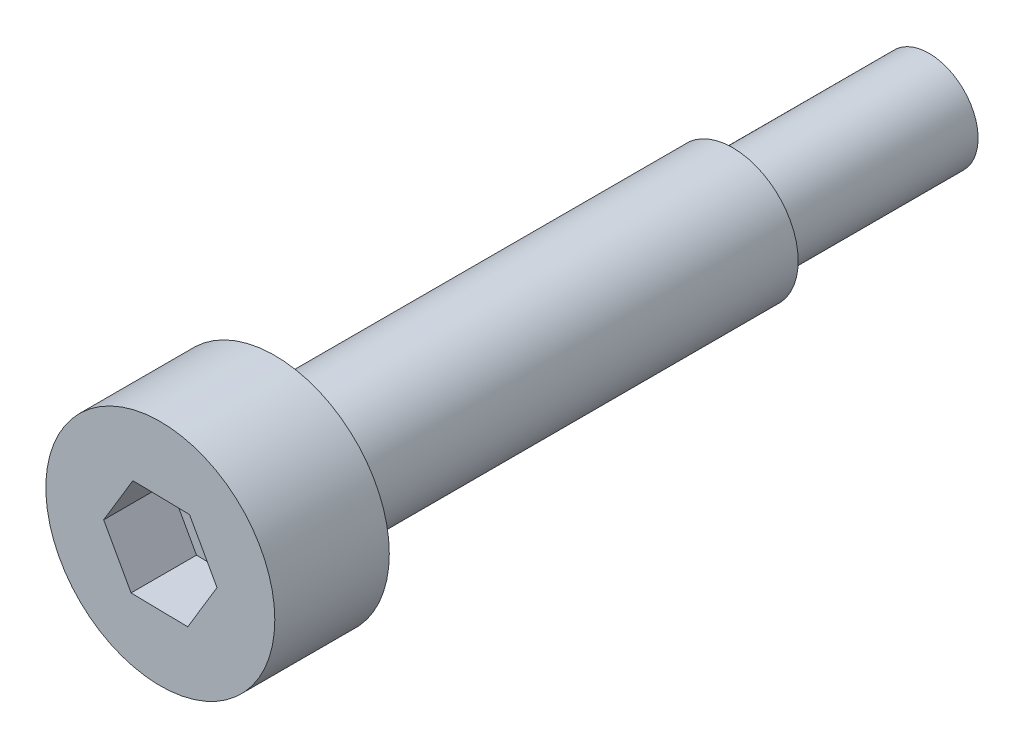
ISO-10303-21;
HEADER;
FILE_DESCRIPTION(('STEP AP214'),'2;1');
FILE_NAME('part.step','',(''),(''),'','','');
FILE_SCHEMA(('AUTOMOTIVE_DESIGN { 1 0 10303 214 1 1 1 1 }'));
ENDSEC;
DATA;
#1=APPLICATION_CONTEXT('core data for automotive mechanical design processes');
#2=APPLICATION_PROTOCOL_DEFINITION('international standard','automotive_design',2000,#1);
#3=PRODUCT_CONTEXT('',#1,'mechanical');
#4=PRODUCT('Part','Part','',(#3));
#5=PRODUCT_RELATED_PRODUCT_CATEGORY('part','',(#4));
#6=PRODUCT_DEFINITION_FORMATION('','',#4);
#7=PRODUCT_DEFINITION_CONTEXT('part definition',#1,'design');
#8=PRODUCT_DEFINITION('design','',#6,#7);
#9=PRODUCT_DEFINITION_SHAPE('','',#8);
#10=(LENGTH_UNIT() NAMED_UNIT(*) SI_UNIT(.MILLI.,.METRE.));
#11=(NAMED_UNIT(*) PLANE_ANGLE_UNIT() SI_UNIT($,.RADIAN.));
#12=(NAMED_UNIT(*) SI_UNIT($,.STERADIAN.) SOLID_ANGLE_UNIT());
#13=UNCERTAINTY_MEASURE_WITH_UNIT(LENGTH_MEASURE(1.E-05),#10,'distance_accuracy_value','');
#14=(GEOMETRIC_REPRESENTATION_CONTEXT(3) GLOBAL_UNCERTAINTY_ASSIGNED_CONTEXT((#13)) GLOBAL_UNIT_ASSIGNED_CONTEXT((#10,
#11,#12)) REPRESENTATION_CONTEXT('',''));
#15=CARTESIAN_POINT('',(0.,0.,0.));
#16=DIRECTION('',(0.,0.,1.));
#17=DIRECTION('',(1.,0.,0.));
#18=AXIS2_PLACEMENT_3D('',#15,#16,#17);
#19=CARTESIAN_POINT('',(0.,0.,3.5));
#20=DIRECTION('',(0.,0.,-1.));
#21=DIRECTION('',(-1.,0.,0.));
#22=AXIS2_PLACEMENT_3D('',#19,#20,#21);
#23=CYLINDRICAL_SURFACE('',#22,3.5);
#24=CARTESIAN_POINT('',(0.,0.,3.5));
#25=DIRECTION('',(0.,0.,1.));
#26=DIRECTION('',(1.,0.,0.));
#27=AXIS2_PLACEMENT_3D('',#24,#25,#26);
#28=CIRCLE('',#27,3.5);
#29=CARTESIAN_POINT('',(3.5,0.,3.5));
#30=VERTEX_POINT('',#29);
#31=EDGE_CURVE('E43',#30,#30,#28,.T.);
#32=ORIENTED_EDGE('',*,*,#31,.F.);
#33=EDGE_LOOP('',(#32));
#34=FACE_BOUND('',#33,.T.);
#35=CARTESIAN_POINT('',(0.,0.,0.));
#36=DIRECTION('',(0.,0.,1.));
#37=DIRECTION('',(1.,0.,0.));
#38=AXIS2_PLACEMENT_3D('',#35,#36,#37);
#39=CIRCLE('',#38,3.5);
#40=CARTESIAN_POINT('',(3.5,0.,0.));
#41=VERTEX_POINT('',#40);
#42=EDGE_CURVE('E138',#41,#41,#39,.T.);
#43=ORIENTED_EDGE('',*,*,#42,.T.);
#44=EDGE_LOOP('',(#43));
#45=FACE_BOUND('',#44,.T.);
#46=ADVANCED_FACE('F36',(#34,#45),#23,.T.);
#47=CARTESIAN_POINT('',(0.,0.,3.5));
#48=DIRECTION('',(0.,0.,1.));
#49=DIRECTION('',(1.,0.,0.));
#50=AXIS2_PLACEMENT_3D('',#47,#48,#49);
#51=PLANE('',#50);
#52=DIRECTION('',(-0.483885708586405,0.875131202178183,0.));
#53=VECTOR('',#52,1.);
#54=CARTESIAN_POINT('',(1.73175411943134,-0.0320572898511147,3.5));
#55=LINE('',#54,#53);
#56=CARTESIAN_POINT('',(1.73175411943134,-0.0320572898511147,3.5));
#57=VERTEX_POINT('',#56);
#58=CARTESIAN_POINT('',(0.893639487103215,1.48371441561033,3.5));
#59=VERTEX_POINT('',#58);
#60=EDGE_CURVE('E50',#57,#59,#55,.T.);
#61=ORIENTED_EDGE('',*,*,#60,.F.);
#62=DIRECTION('',(0.51594299843752,0.856622917253152,0.));
#63=VECTOR('',#62,1.);
#64=CARTESIAN_POINT('',(0.838114632328121,-1.51577170546145,3.5));
#65=LINE('',#64,#63);
#66=CARTESIAN_POINT('',(0.838114632328121,-1.51577170546145,3.5));
#67=VERTEX_POINT('',#66);
#68=EDGE_CURVE('E134',#67,#57,#65,.T.);
#69=ORIENTED_EDGE('',*,*,#68,.F.);
#70=DIRECTION('',(0.999828707023925,-0.0185082849250311,0.));
#71=VECTOR('',#70,1.);
#72=CARTESIAN_POINT('',(-0.893639487103214,-1.48371441561033,3.5));
#73=LINE('',#72,#71);
#74=CARTESIAN_POINT('',(-0.893639487103214,-1.48371441561033,3.5));
#75=VERTEX_POINT('',#74);
#76=EDGE_CURVE('E132',#75,#67,#73,.T.);
#77=ORIENTED_EDGE('',*,*,#76,.F.);
#78=DIRECTION('',(0.483885708586405,-0.875131202178183,0.));
#79=VECTOR('',#78,1.);
#80=CARTESIAN_POINT('',(-1.73175411943134,0.0320572898511147,3.5));
#81=LINE('',#80,#79);
#82=CARTESIAN_POINT('',(-1.73175411943134,0.0320572898511147,3.5));
#83=VERTEX_POINT('',#82);
#84=EDGE_CURVE('E98',#83,#75,#81,.T.);
#85=ORIENTED_EDGE('',*,*,#84,.F.);
#86=DIRECTION('',(-0.51594299843752,-0.856622917253152,0.));
#87=VECTOR('',#86,1.);
#88=CARTESIAN_POINT('',(-0.838114632328121,1.51577170546145,3.5));
#89=LINE('',#88,#87);
#90=CARTESIAN_POINT('',(-0.838114632328121,1.51577170546145,3.5));
#91=VERTEX_POINT('',#90);
#92=EDGE_CURVE('E128',#91,#83,#89,.T.);
#93=ORIENTED_EDGE('',*,*,#92,.F.);
#94=DIRECTION('',(-0.999828707023925,0.0185082849250311,0.));
#95=VECTOR('',#94,1.);
#96=CARTESIAN_POINT('',(0.893639487103215,1.48371441561033,3.5));
#97=LINE('',#96,#95);
#98=EDGE_CURVE('E124',#59,#91,#97,.T.);
#99=ORIENTED_EDGE('',*,*,#98,.F.);
#100=EDGE_LOOP('',(#61,#69,#77,#85,#93,#99));
#101=FACE_BOUND('',#100,.T.);
#102=ORIENTED_EDGE('',*,*,#31,.T.);
#103=EDGE_LOOP('',(#102));
#104=FACE_BOUND('',#103,.T.);
#105=ADVANCED_FACE('F152',(#101,#104),#51,.T.);
#106=CARTESIAN_POINT('',(0.,0.,0.));
#107=DIRECTION('',(0.,0.,1.));
#108=DIRECTION('',(1.,0.,0.));
#109=AXIS2_PLACEMENT_3D('',#106,#107,#108);
#110=PLANE('',#109);
#111=CARTESIAN_POINT('',(0.,0.,0.));
#112=DIRECTION('',(0.,0.,1.));
#113=DIRECTION('',(1.,0.,0.));
#114=AXIS2_PLACEMENT_3D('',#111,#112,#113);
#115=CIRCLE('',#114,2.);
#116=CARTESIAN_POINT('',(2.,0.,0.));
#117=VERTEX_POINT('',#116);
#118=EDGE_CURVE('E11',#117,#117,#115,.F.);
#119=ORIENTED_EDGE('',*,*,#118,.F.);
#120=EDGE_LOOP('',(#119));
#121=FACE_BOUND('',#120,.T.);
#122=ORIENTED_EDGE('',*,*,#42,.F.);
#123=EDGE_LOOP('',(#122));
#124=FACE_BOUND('',#123,.T.);
#125=ADVANCED_FACE('F149',(#121,#124),#110,.F.);
#126=CARTESIAN_POINT('',(1.73175411943134,-0.0320572898511147,1.5));
#127=DIRECTION('',(0.875131202178183,0.483885708586405,0.));
#128=DIRECTION('',(-0.483885708586405,0.875131202178183,0.));
#129=AXIS2_PLACEMENT_3D('',#126,#127,#128);
#130=PLANE('',#129);
#131=ORIENTED_EDGE('',*,*,#60,.T.);
#132=DIRECTION('',(0.,0.,1.));
#133=VECTOR('',#132,1.);
#134=CARTESIAN_POINT('',(0.893639487103215,1.48371441561033,1.5));
#135=LINE('',#134,#133);
#136=CARTESIAN_POINT('',(0.893639487103215,1.48371441561033,1.5));
#137=VERTEX_POINT('',#136);
#138=EDGE_CURVE('E80',#137,#59,#135,.T.);
#139=ORIENTED_EDGE('',*,*,#138,.F.);
#140=DIRECTION('',(-0.483885708586405,0.875131202178183,0.));
#141=VECTOR('',#140,1.);
#142=CARTESIAN_POINT('',(1.73175411943134,-0.0320572898511147,1.5));
#143=LINE('',#142,#141);
#144=CARTESIAN_POINT('',(1.73175411943134,-0.0320572898511147,1.5));
#145=VERTEX_POINT('',#144);
#146=EDGE_CURVE('E136',#145,#137,#143,.T.);
#147=ORIENTED_EDGE('',*,*,#146,.F.);
#148=DIRECTION('',(0.,0.,1.));
#149=VECTOR('',#148,1.);
#150=CARTESIAN_POINT('',(1.73175411943134,-0.0320572898511147,1.5));
#151=LINE('',#150,#149);
#152=EDGE_CURVE('E58',#145,#57,#151,.T.);
#153=ORIENTED_EDGE('',*,*,#152,.T.);
#154=EDGE_LOOP('',(#131,#139,#147,#153));
#155=FACE_BOUND('',#154,.T.);
#156=ADVANCED_FACE('F151',(#155),#130,.F.);
#157=CARTESIAN_POINT('',(0.838114632328121,-1.51577170546145,1.5));
#158=DIRECTION('',(0.856622917253152,-0.51594299843752,0.));
#159=DIRECTION('',(0.51594299843752,0.856622917253153,0.));
#160=AXIS2_PLACEMENT_3D('',#157,#158,#159);
#161=PLANE('',#160);
#162=ORIENTED_EDGE('',*,*,#68,.T.);
#163=ORIENTED_EDGE('',*,*,#152,.F.);
#164=DIRECTION('',(0.51594299843752,0.856622917253152,0.));
#165=VECTOR('',#164,1.);
#166=CARTESIAN_POINT('',(0.838114632328121,-1.51577170546145,1.5));
#167=LINE('',#166,#165);
#168=CARTESIAN_POINT('',(0.838114632328121,-1.51577170546145,1.5));
#169=VERTEX_POINT('',#168);
#170=EDGE_CURVE('E110',#169,#145,#167,.T.);
#171=ORIENTED_EDGE('',*,*,#170,.F.);
#172=DIRECTION('',(0.,0.,1.));
#173=VECTOR('',#172,1.);
#174=CARTESIAN_POINT('',(0.838114632328121,-1.51577170546145,1.5));
#175=LINE('',#174,#173);
#176=EDGE_CURVE('E102',#169,#67,#175,.T.);
#177=ORIENTED_EDGE('',*,*,#176,.T.);
#178=EDGE_LOOP('',(#162,#163,#171,#177));
#179=FACE_BOUND('',#178,.T.);
#180=ADVANCED_FACE('F158',(#179),#161,.F.);
#181=CARTESIAN_POINT('',(-0.893639487103214,-1.48371441561033,1.5));
#182=DIRECTION('',(-0.0185082849250311,-0.999828707023925,0.));
#183=DIRECTION('',(0.999828707023925,-0.0185082849250311,0.));
#184=AXIS2_PLACEMENT_3D('',#181,#182,#183);
#185=PLANE('',#184);
#186=ORIENTED_EDGE('',*,*,#76,.T.);
#187=ORIENTED_EDGE('',*,*,#176,.F.);
#188=DIRECTION('',(0.999828707023925,-0.0185082849250311,0.));
#189=VECTOR('',#188,1.);
#190=CARTESIAN_POINT('',(-0.893639487103214,-1.48371441561033,1.5));
#191=LINE('',#190,#189);
#192=CARTESIAN_POINT('',(-0.893639487103214,-1.48371441561033,1.5));
#193=VERTEX_POINT('',#192);
#194=EDGE_CURVE('E106',#193,#169,#191,.T.);
#195=ORIENTED_EDGE('',*,*,#194,.F.);
#196=DIRECTION('',(0.,0.,1.));
#197=VECTOR('',#196,1.);
#198=CARTESIAN_POINT('',(-0.893639487103214,-1.48371441561033,1.5));
#199=LINE('',#198,#197);
#200=EDGE_CURVE('E91',#193,#75,#199,.T.);
#201=ORIENTED_EDGE('',*,*,#200,.T.);
#202=EDGE_LOOP('',(#186,#187,#195,#201));
#203=FACE_BOUND('',#202,.T.);
#204=ADVANCED_FACE('F107',(#203),#185,.F.);
#205=CARTESIAN_POINT('',(-1.73175411943134,0.0320572898511147,1.5));
#206=DIRECTION('',(-0.875131202178183,-0.483885708586405,0.));
#207=DIRECTION('',(0.483885708586405,-0.875131202178183,0.));
#208=AXIS2_PLACEMENT_3D('',#205,#206,#207);
#209=PLANE('',#208);
#210=ORIENTED_EDGE('',*,*,#84,.T.);
#211=ORIENTED_EDGE('',*,*,#200,.F.);
#212=DIRECTION('',(0.483885708586405,-0.875131202178183,0.));
#213=VECTOR('',#212,1.);
#214=CARTESIAN_POINT('',(-1.73175411943134,0.0320572898511147,1.5));
#215=LINE('',#214,#213);
#216=CARTESIAN_POINT('',(-1.73175411943134,0.0320572898511147,1.5));
#217=VERTEX_POINT('',#216);
#218=EDGE_CURVE('E95',#217,#193,#215,.T.);
#219=ORIENTED_EDGE('',*,*,#218,.F.);
#220=DIRECTION('',(0.,0.,1.));
#221=VECTOR('',#220,1.);
#222=CARTESIAN_POINT('',(-1.73175411943134,0.0320572898511147,1.5));
#223=LINE('',#222,#221);
#224=EDGE_CURVE('E103',#217,#83,#223,.T.);
#225=ORIENTED_EDGE('',*,*,#224,.T.);
#226=EDGE_LOOP('',(#210,#211,#219,#225));
#227=FACE_BOUND('',#226,.T.);
#228=ADVANCED_FACE('F93',(#227),#209,.F.);
#229=CARTESIAN_POINT('',(-0.838114632328121,1.51577170546145,1.5));
#230=DIRECTION('',(-0.856622917253152,0.51594299843752,0.));
#231=DIRECTION('',(-0.51594299843752,-0.856622917253153,0.));
#232=AXIS2_PLACEMENT_3D('',#229,#230,#231);
#233=PLANE('',#232);
#234=ORIENTED_EDGE('',*,*,#92,.T.);
#235=ORIENTED_EDGE('',*,*,#224,.F.);
#236=DIRECTION('',(-0.51594299843752,-0.856622917253152,0.));
#237=VECTOR('',#236,1.);
#238=CARTESIAN_POINT('',(-0.838114632328121,1.51577170546145,1.5));
#239=LINE('',#238,#237);
#240=CARTESIAN_POINT('',(-0.838114632328121,1.51577170546145,1.5));
#241=VERTEX_POINT('',#240);
#242=EDGE_CURVE('E116',#241,#217,#239,.T.);
#243=ORIENTED_EDGE('',*,*,#242,.F.);
#244=DIRECTION('',(0.,0.,1.));
#245=VECTOR('',#244,1.);
#246=CARTESIAN_POINT('',(-0.838114632328121,1.51577170546145,1.5));
#247=LINE('',#246,#245);
#248=EDGE_CURVE('E141',#241,#91,#247,.T.);
#249=ORIENTED_EDGE('',*,*,#248,.T.);
#250=EDGE_LOOP('',(#234,#235,#243,#249));
#251=FACE_BOUND('',#250,.T.);
#252=ADVANCED_FACE('F205',(#251),#233,.F.);
#253=CARTESIAN_POINT('',(0.893639487103215,1.48371441561033,1.5));
#254=DIRECTION('',(0.0185082849250311,0.999828707023925,0.));
#255=DIRECTION('',(-0.999828707023925,0.0185082849250311,0.));
#256=AXIS2_PLACEMENT_3D('',#253,#254,#255);
#257=PLANE('',#256);
#258=ORIENTED_EDGE('',*,*,#98,.T.);
#259=ORIENTED_EDGE('',*,*,#248,.F.);
#260=DIRECTION('',(-0.999828707023925,0.0185082849250311,0.));
#261=VECTOR('',#260,1.);
#262=CARTESIAN_POINT('',(0.893639487103215,1.48371441561033,1.5));
#263=LINE('',#262,#261);
#264=EDGE_CURVE('E118',#137,#241,#263,.T.);
#265=ORIENTED_EDGE('',*,*,#264,.F.);
#266=ORIENTED_EDGE('',*,*,#138,.T.);
#267=EDGE_LOOP('',(#258,#259,#265,#266));
#268=FACE_BOUND('',#267,.T.);
#269=ADVANCED_FACE('F214',(#268),#257,.F.);
#270=CARTESIAN_POINT('',(0.,0.,1.5));
#271=DIRECTION('',(0.,0.,1.));
#272=DIRECTION('',(1.,0.,0.));
#273=AXIS2_PLACEMENT_3D('',#270,#271,#272);
#274=PLANE('',#273);
#275=ORIENTED_EDGE('',*,*,#146,.T.);
#276=ORIENTED_EDGE('',*,*,#264,.T.);
#277=ORIENTED_EDGE('',*,*,#242,.T.);
#278=ORIENTED_EDGE('',*,*,#218,.T.);
#279=ORIENTED_EDGE('',*,*,#194,.T.);
#280=ORIENTED_EDGE('',*,*,#170,.T.);
#281=EDGE_LOOP('',(#275,#276,#277,#278,#279,#280));
#282=FACE_BOUND('',#281,.T.);
#283=ADVANCED_FACE('F113',(#282),#274,.T.);
#284=CARTESIAN_POINT('',(0.,0.,-14.));
#285=DIRECTION('',(0.,0.,1.));
#286=DIRECTION('',(1.,0.,0.));
#287=AXIS2_PLACEMENT_3D('',#284,#285,#286);
#288=CYLINDRICAL_SURFACE('',#287,2.);
#289=CARTESIAN_POINT('',(0.,0.,-14.));
#290=DIRECTION('',(0.,0.,-1.));
#291=DIRECTION('',(-1.,0.,0.));
#292=AXIS2_PLACEMENT_3D('',#289,#290,#291);
#293=CIRCLE('',#292,2.);
#294=CARTESIAN_POINT('',(-2.,0.,-14.));
#295=VERTEX_POINT('',#294);
#296=EDGE_CURVE('E125',#295,#295,#293,.T.);
#297=ORIENTED_EDGE('',*,*,#296,.F.);
#298=EDGE_LOOP('',(#297));
#299=FACE_BOUND('',#298,.T.);
#300=ORIENTED_EDGE('',*,*,#118,.T.);
#301=EDGE_LOOP('',(#300));
#302=FACE_BOUND('',#301,.T.);
#303=ADVANCED_FACE('F232',(#299,#302),#288,.T.);
#304=CARTESIAN_POINT('',(0.,0.,-14.));
#305=DIRECTION('',(0.,0.,-1.));
#306=DIRECTION('',(-1.,0.,0.));
#307=AXIS2_PLACEMENT_3D('',#304,#305,#306);
#308=PLANE('',#307);
#309=CARTESIAN_POINT('',(0.,0.,-14.));
#310=DIRECTION('',(0.,0.,-1.));
#311=DIRECTION('',(-1.,0.,0.));
#312=AXIS2_PLACEMENT_3D('',#309,#310,#311);
#313=CIRCLE('',#312,1.5);
#314=CARTESIAN_POINT('',(-1.5,0.,-14.));
#315=VERTEX_POINT('',#314);
#316=EDGE_CURVE('E284',#315,#315,#313,.T.);
#317=ORIENTED_EDGE('',*,*,#316,.F.);
#318=EDGE_LOOP('',(#317));
#319=FACE_BOUND('',#318,.T.);
#320=ORIENTED_EDGE('',*,*,#296,.T.);
#321=EDGE_LOOP('',(#320));
#322=FACE_BOUND('',#321,.T.);
#323=ADVANCED_FACE('F245',(#319,#322),#308,.T.);
#324=CARTESIAN_POINT('',(0.,0.,-20.));
#325=DIRECTION('',(0.,0.,1.));
#326=DIRECTION('',(1.,0.,0.));
#327=AXIS2_PLACEMENT_3D('',#324,#325,#326);
#328=CYLINDRICAL_SURFACE('',#327,1.5);
#329=CARTESIAN_POINT('',(0.,0.,-20.));
#330=DIRECTION('',(0.,0.,-1.));
#331=DIRECTION('',(-1.,0.,0.));
#332=AXIS2_PLACEMENT_3D('',#329,#330,#331);
#333=CIRCLE('',#332,1.5);
#334=CARTESIAN_POINT('',(-1.5,0.,-20.));
#335=VERTEX_POINT('',#334);
#336=EDGE_CURVE('E283',#335,#335,#333,.T.);
#337=ORIENTED_EDGE('',*,*,#336,.F.);
#338=EDGE_LOOP('',(#337));
#339=FACE_BOUND('',#338,.T.);
#340=ORIENTED_EDGE('',*,*,#316,.T.);
#341=EDGE_LOOP('',(#340));
#342=FACE_BOUND('',#341,.T.);
#343=ADVANCED_FACE('F255',(#339,#342),#328,.T.);
#344=CARTESIAN_POINT('',(0.,0.,-20.));
#345=DIRECTION('',(0.,0.,-1.));
#346=DIRECTION('',(-1.,0.,0.));
#347=AXIS2_PLACEMENT_3D('',#344,#345,#346);
#348=PLANE('',#347);
#349=ORIENTED_EDGE('',*,*,#336,.T.);
#350=EDGE_LOOP('',(#349));
#351=FACE_BOUND('',#350,.T.);
#352=ADVANCED_FACE('F266',(#351),#348,.T.);
#353=CLOSED_SHELL('',(#46,#105,#125,#156,#180,#204,#228,#252,#269,#283,#303,#323,#343,#352));
#354=MANIFOLD_SOLID_BREP('B2',#353);
#355=ADVANCED_BREP_SHAPE_REPRESENTATION('',(#18,#354),#14);
#356=SHAPE_DEFINITION_REPRESENTATION(#9,#355);
ENDSEC;
END-ISO-10303-21;
